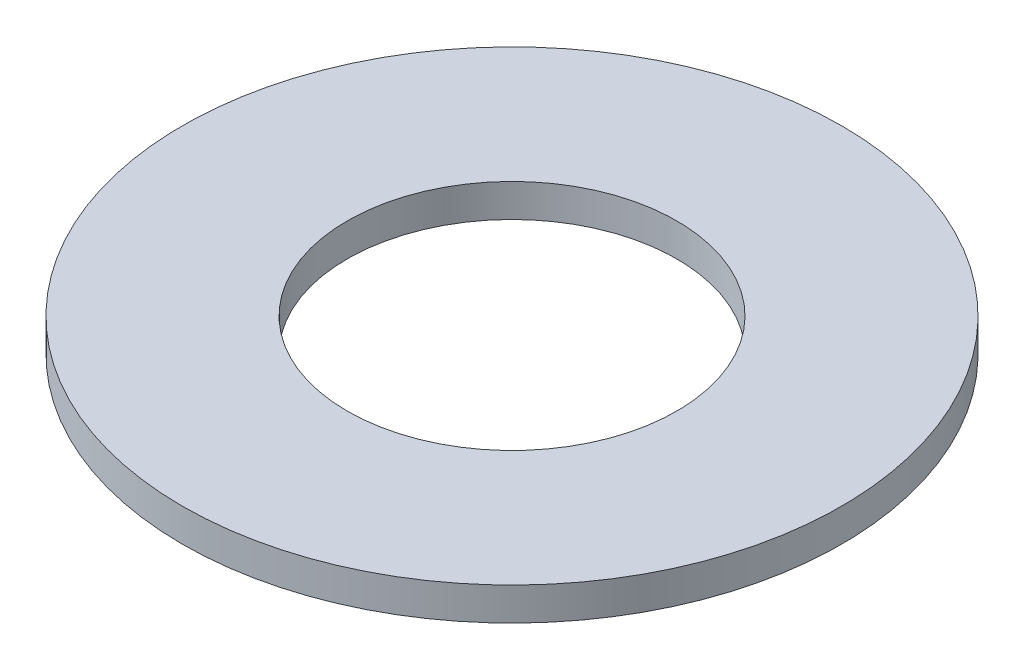
ISO-10303-21;
HEADER;
FILE_DESCRIPTION(('STEP AP214'),'2;1');
FILE_NAME('part.step','',(''),(''),'','','');
FILE_SCHEMA(('AUTOMOTIVE_DESIGN { 1 0 10303 214 1 1 1 1 }'));
ENDSEC;
DATA;
#1=APPLICATION_CONTEXT('core data for automotive mechanical design processes');
#2=APPLICATION_PROTOCOL_DEFINITION('international standard','automotive_design',2000,#1);
#3=PRODUCT_CONTEXT('',#1,'mechanical');
#4=PRODUCT('Part','Part','',(#3));
#5=PRODUCT_RELATED_PRODUCT_CATEGORY('part','',(#4));
#6=PRODUCT_DEFINITION_FORMATION('','',#4);
#7=PRODUCT_DEFINITION_CONTEXT('part definition',#1,'design');
#8=PRODUCT_DEFINITION('design','',#6,#7);
#9=PRODUCT_DEFINITION_SHAPE('','',#8);
#10=(LENGTH_UNIT() NAMED_UNIT(*) SI_UNIT(.MILLI.,.METRE.));
#11=(NAMED_UNIT(*) PLANE_ANGLE_UNIT() SI_UNIT($,.RADIAN.));
#12=(NAMED_UNIT(*) SI_UNIT($,.STERADIAN.) SOLID_ANGLE_UNIT());
#13=UNCERTAINTY_MEASURE_WITH_UNIT(LENGTH_MEASURE(1.E-05),#10,'distance_accuracy_value','');
#14=(GEOMETRIC_REPRESENTATION_CONTEXT(3) GLOBAL_UNCERTAINTY_ASSIGNED_CONTEXT((#13)) GLOBAL_UNIT_ASSIGNED_CONTEXT((#10,
#11,#12)) REPRESENTATION_CONTEXT('',''));
#15=CARTESIAN_POINT('',(0.,0.,0.));
#16=DIRECTION('',(0.,0.,1.));
#17=DIRECTION('',(1.,0.,0.));
#18=AXIS2_PLACEMENT_3D('',#15,#16,#17);
#19=CARTESIAN_POINT('',(0.,0.2,0.));
#20=DIRECTION('',(0.,1.,0.));
#21=DIRECTION('',(0.,0.,1.));
#22=AXIS2_PLACEMENT_3D('',#19,#20,#21);
#23=PLANE('',#22);
#24=CARTESIAN_POINT('',(0.,0.2,0.));
#25=DIRECTION('',(0.,1.,0.));
#26=DIRECTION('',(0.,0.,1.));
#27=AXIS2_PLACEMENT_3D('',#24,#25,#26);
#28=CIRCLE('',#27,2.);
#29=CARTESIAN_POINT('',(0.,0.2,2.));
#30=VERTEX_POINT('',#29);
#31=EDGE_CURVE('E10',#30,#30,#28,.T.);
#32=ORIENTED_EDGE('',*,*,#31,.T.);
#33=EDGE_LOOP('',(#32));
#34=FACE_BOUND('',#33,.T.);
#35=CARTESIAN_POINT('',(0.,0.2,0.));
#36=DIRECTION('',(0.,1.,0.));
#37=DIRECTION('',(0.,0.,1.));
#38=AXIS2_PLACEMENT_3D('',#35,#36,#37);
#39=CIRCLE('',#38,1.);
#40=CARTESIAN_POINT('',(0.,0.2,1.));
#41=VERTEX_POINT('',#40);
#42=EDGE_CURVE('E45',#41,#41,#39,.T.);
#43=ORIENTED_EDGE('',*,*,#42,.F.);
#44=EDGE_LOOP('',(#43));
#45=FACE_BOUND('',#44,.T.);
#46=ADVANCED_FACE('F34',(#34,#45),#23,.T.);
#47=CARTESIAN_POINT('',(0.,0.,0.));
#48=DIRECTION('',(0.,1.,0.));
#49=DIRECTION('',(0.,0.,1.));
#50=AXIS2_PLACEMENT_3D('',#47,#48,#49);
#51=PLANE('',#50);
#52=CARTESIAN_POINT('',(0.,0.,0.));
#53=DIRECTION('',(0.,1.,0.));
#54=DIRECTION('',(0.,0.,1.));
#55=AXIS2_PLACEMENT_3D('',#52,#53,#54);
#56=CIRCLE('',#55,2.);
#57=CARTESIAN_POINT('',(0.,0.,2.));
#58=VERTEX_POINT('',#57);
#59=EDGE_CURVE('E38',#58,#58,#56,.T.);
#60=ORIENTED_EDGE('',*,*,#59,.F.);
#61=EDGE_LOOP('',(#60));
#62=FACE_BOUND('',#61,.T.);
#63=CARTESIAN_POINT('',(0.,0.,0.));
#64=DIRECTION('',(0.,1.,0.));
#65=DIRECTION('',(0.,0.,1.));
#66=AXIS2_PLACEMENT_3D('',#63,#64,#65);
#67=CIRCLE('',#66,1.);
#68=CARTESIAN_POINT('',(0.,0.,1.));
#69=VERTEX_POINT('',#68);
#70=EDGE_CURVE('E47',#69,#69,#67,.T.);
#71=ORIENTED_EDGE('',*,*,#70,.T.);
#72=EDGE_LOOP('',(#71));
#73=FACE_BOUND('',#72,.T.);
#74=ADVANCED_FACE('F57',(#62,#73),#51,.F.);
#75=CARTESIAN_POINT('',(0.,0.2,0.));
#76=DIRECTION('',(0.,-1.,0.));
#77=DIRECTION('',(0.,0.,-1.));
#78=AXIS2_PLACEMENT_3D('',#75,#76,#77);
#79=CYLINDRICAL_SURFACE('',#78,2.);
#80=ORIENTED_EDGE('',*,*,#31,.F.);
#81=EDGE_LOOP('',(#80));
#82=FACE_BOUND('',#81,.T.);
#83=ORIENTED_EDGE('',*,*,#59,.T.);
#84=EDGE_LOOP('',(#83));
#85=FACE_BOUND('',#84,.T.);
#86=ADVANCED_FACE('F36',(#82,#85),#79,.T.);
#87=CARTESIAN_POINT('',(0.,0.2,0.));
#88=DIRECTION('',(0.,-1.,0.));
#89=DIRECTION('',(0.,0.,-1.));
#90=AXIS2_PLACEMENT_3D('',#87,#88,#89);
#91=CYLINDRICAL_SURFACE('',#90,1.);
#92=ORIENTED_EDGE('',*,*,#42,.T.);
#93=EDGE_LOOP('',(#92));
#94=FACE_BOUND('',#93,.T.);
#95=ORIENTED_EDGE('',*,*,#70,.F.);
#96=EDGE_LOOP('',(#95));
#97=FACE_BOUND('',#96,.T.);
#98=ADVANCED_FACE('F53',(#94,#97),#91,.F.);
#99=CLOSED_SHELL('',(#46,#74,#86,#98));
#100=MANIFOLD_SOLID_BREP('B2',#99);
#101=ADVANCED_BREP_SHAPE_REPRESENTATION('',(#18,#100),#14);
#102=SHAPE_DEFINITION_REPRESENTATION(#9,#101);
ENDSEC;
END-ISO-10303-21;
